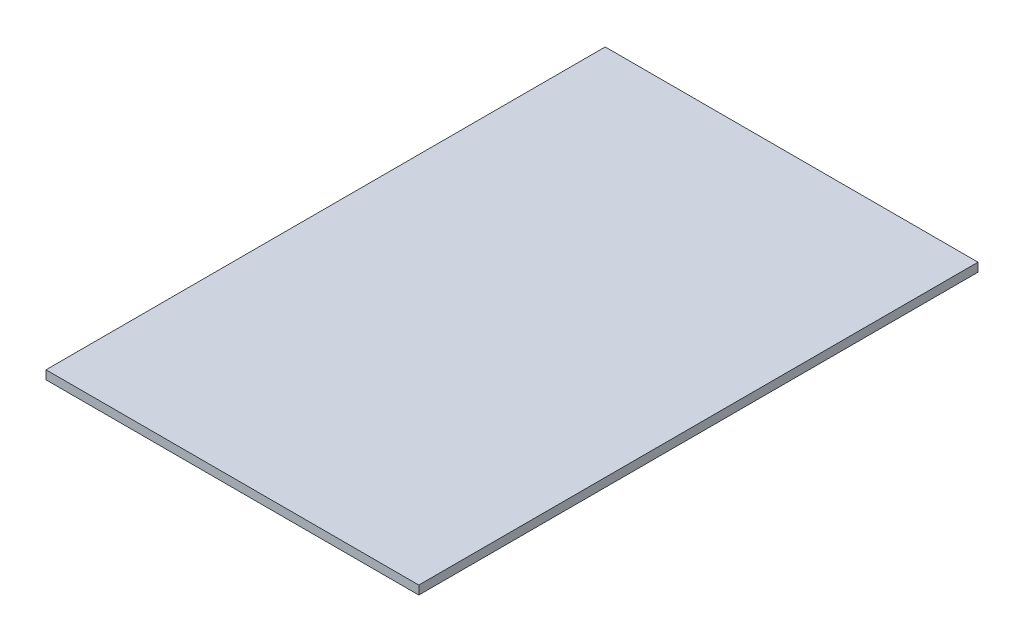
ISO-10303-21;
HEADER;
FILE_DESCRIPTION(('STEP AP214'),'2;1');
FILE_NAME('part.step','',(''),(''),'','','');
FILE_SCHEMA(('AUTOMOTIVE_DESIGN { 1 0 10303 214 1 1 1 1 }'));
ENDSEC;
DATA;
#1=APPLICATION_CONTEXT('core data for automotive mechanical design processes');
#2=APPLICATION_PROTOCOL_DEFINITION('international standard','automotive_design',2000,#1);
#3=PRODUCT_CONTEXT('',#1,'mechanical');
#4=PRODUCT('Part','Part','',(#3));
#5=PRODUCT_RELATED_PRODUCT_CATEGORY('part','',(#4));
#6=PRODUCT_DEFINITION_FORMATION('','',#4);
#7=PRODUCT_DEFINITION_CONTEXT('part definition',#1,'design');
#8=PRODUCT_DEFINITION('design','',#6,#7);
#9=PRODUCT_DEFINITION_SHAPE('','',#8);
#10=(LENGTH_UNIT() NAMED_UNIT(*) SI_UNIT(.MILLI.,.METRE.));
#11=(NAMED_UNIT(*) PLANE_ANGLE_UNIT() SI_UNIT($,.RADIAN.));
#12=(NAMED_UNIT(*) SI_UNIT($,.STERADIAN.) SOLID_ANGLE_UNIT());
#13=UNCERTAINTY_MEASURE_WITH_UNIT(LENGTH_MEASURE(1.E-05),#10,'distance_accuracy_value','');
#14=(GEOMETRIC_REPRESENTATION_CONTEXT(3) GLOBAL_UNCERTAINTY_ASSIGNED_CONTEXT((#13)) GLOBAL_UNIT_ASSIGNED_CONTEXT((#10,
#11,#12)) REPRESENTATION_CONTEXT('',''));
#15=CARTESIAN_POINT('',(0.,0.,0.));
#16=DIRECTION('',(0.,0.,1.));
#17=DIRECTION('',(1.,0.,0.));
#18=AXIS2_PLACEMENT_3D('',#15,#16,#17);
#19=CARTESIAN_POINT('',(0.,14.,0.));
#20=DIRECTION('',(1.,0.,0.));
#21=DIRECTION('',(0.,0.,-1.));
#22=AXIS2_PLACEMENT_3D('',#19,#20,#21);
#23=PLANE('',#22);
#24=DIRECTION('',(0.,0.,1.));
#25=VECTOR('',#24,1.);
#26=CARTESIAN_POINT('',(0.,0.,0.));
#27=LINE('',#26,#25);
#28=CARTESIAN_POINT('',(-1.2490009027033E-13,0.,-900.));
#29=VERTEX_POINT('',#28);
#30=CARTESIAN_POINT('',(0.,0.,0.));
#31=VERTEX_POINT('',#30);
#32=EDGE_CURVE('E107',#29,#31,#27,.T.);
#33=ORIENTED_EDGE('',*,*,#32,.T.);
#34=DIRECTION('',(0.,-1.,0.));
#35=VECTOR('',#34,1.);
#36=CARTESIAN_POINT('',(0.,14.,0.));
#37=LINE('',#36,#35);
#38=CARTESIAN_POINT('',(0.,14.,0.));
#39=VERTEX_POINT('',#38);
#40=EDGE_CURVE('E11',#39,#31,#37,.T.);
#41=ORIENTED_EDGE('',*,*,#40,.F.);
#42=DIRECTION('',(0.,0.,1.));
#43=VECTOR('',#42,1.);
#44=CARTESIAN_POINT('',(0.,14.,0.));
#45=LINE('',#44,#43);
#46=CARTESIAN_POINT('',(-1.2490009027033E-13,14.,-900.));
#47=VERTEX_POINT('',#46);
#48=EDGE_CURVE('E91',#47,#39,#45,.T.);
#49=ORIENTED_EDGE('',*,*,#48,.F.);
#50=DIRECTION('',(0.,-1.,0.));
#51=VECTOR('',#50,1.);
#52=CARTESIAN_POINT('',(-1.2490009027033E-13,14.,-900.));
#53=LINE('',#52,#51);
#54=EDGE_CURVE('E103',#47,#29,#53,.T.);
#55=ORIENTED_EDGE('',*,*,#54,.T.);
#56=EDGE_LOOP('',(#33,#41,#49,#55));
#57=FACE_BOUND('',#56,.T.);
#58=ADVANCED_FACE('F39',(#57),#23,.F.);
#59=CARTESIAN_POINT('',(0.,14.,0.));
#60=DIRECTION('',(0.,0.,-1.));
#61=DIRECTION('',(-1.,0.,0.));
#62=AXIS2_PLACEMENT_3D('',#59,#60,#61);
#63=PLANE('',#62);
#64=DIRECTION('',(1.,0.,0.));
#65=VECTOR('',#64,1.);
#66=CARTESIAN_POINT('',(0.,0.,0.));
#67=LINE('',#66,#65);
#68=CARTESIAN_POINT('',(600.,0.,0.));
#69=VERTEX_POINT('',#68);
#70=EDGE_CURVE('E96',#31,#69,#67,.T.);
#71=ORIENTED_EDGE('',*,*,#70,.T.);
#72=DIRECTION('',(0.,-1.,0.));
#73=VECTOR('',#72,1.);
#74=CARTESIAN_POINT('',(600.,14.,0.));
#75=LINE('',#74,#73);
#76=CARTESIAN_POINT('',(600.,14.,0.));
#77=VERTEX_POINT('',#76);
#78=EDGE_CURVE('E48',#77,#69,#75,.T.);
#79=ORIENTED_EDGE('',*,*,#78,.F.);
#80=DIRECTION('',(1.,0.,0.));
#81=VECTOR('',#80,1.);
#82=CARTESIAN_POINT('',(0.,14.,0.));
#83=LINE('',#82,#81);
#84=EDGE_CURVE('E86',#39,#77,#83,.T.);
#85=ORIENTED_EDGE('',*,*,#84,.F.);
#86=ORIENTED_EDGE('',*,*,#40,.T.);
#87=EDGE_LOOP('',(#71,#79,#85,#86));
#88=FACE_BOUND('',#87,.T.);
#89=ADVANCED_FACE('F95',(#88),#63,.F.);
#90=CARTESIAN_POINT('',(600.,14.,0.));
#91=DIRECTION('',(-1.,0.,0.));
#92=DIRECTION('',(0.,0.,1.));
#93=AXIS2_PLACEMENT_3D('',#90,#91,#92);
#94=PLANE('',#93);
#95=DIRECTION('',(0.,0.,-1.));
#96=VECTOR('',#95,1.);
#97=CARTESIAN_POINT('',(600.,0.,0.));
#98=LINE('',#97,#96);
#99=CARTESIAN_POINT('',(600.,0.,-900.));
#100=VERTEX_POINT('',#99);
#101=EDGE_CURVE('E73',#69,#100,#98,.T.);
#102=ORIENTED_EDGE('',*,*,#101,.T.);
#103=DIRECTION('',(0.,-1.,0.));
#104=VECTOR('',#103,1.);
#105=CARTESIAN_POINT('',(600.,14.,-900.));
#106=LINE('',#105,#104);
#107=CARTESIAN_POINT('',(600.,14.,-900.));
#108=VERTEX_POINT('',#107);
#109=EDGE_CURVE('E98',#108,#100,#106,.T.);
#110=ORIENTED_EDGE('',*,*,#109,.F.);
#111=DIRECTION('',(0.,0.,-1.));
#112=VECTOR('',#111,1.);
#113=CARTESIAN_POINT('',(600.,14.,0.));
#114=LINE('',#113,#112);
#115=EDGE_CURVE('E89',#77,#108,#114,.T.);
#116=ORIENTED_EDGE('',*,*,#115,.F.);
#117=ORIENTED_EDGE('',*,*,#78,.T.);
#118=EDGE_LOOP('',(#102,#110,#116,#117));
#119=FACE_BOUND('',#118,.T.);
#120=ADVANCED_FACE('F99',(#119),#94,.F.);
#121=CARTESIAN_POINT('',(-1.2490009027033E-13,14.,-900.));
#122=DIRECTION('',(0.,0.,1.));
#123=DIRECTION('',(1.,0.,0.));
#124=AXIS2_PLACEMENT_3D('',#121,#122,#123);
#125=PLANE('',#124);
#126=DIRECTION('',(-1.,0.,0.));
#127=VECTOR('',#126,1.);
#128=CARTESIAN_POINT('',(-1.2490009027033E-13,0.,-900.));
#129=LINE('',#128,#127);
#130=EDGE_CURVE('E79',#100,#29,#129,.T.);
#131=ORIENTED_EDGE('',*,*,#130,.T.);
#132=ORIENTED_EDGE('',*,*,#54,.F.);
#133=DIRECTION('',(-1.,0.,0.));
#134=VECTOR('',#133,1.);
#135=CARTESIAN_POINT('',(-1.2490009027033E-13,14.,-900.));
#136=LINE('',#135,#134);
#137=EDGE_CURVE('E56',#108,#47,#136,.T.);
#138=ORIENTED_EDGE('',*,*,#137,.F.);
#139=ORIENTED_EDGE('',*,*,#109,.T.);
#140=EDGE_LOOP('',(#131,#132,#138,#139));
#141=FACE_BOUND('',#140,.T.);
#142=ADVANCED_FACE('F120',(#141),#125,.F.);
#143=CARTESIAN_POINT('',(0.,14.,0.));
#144=DIRECTION('',(0.,-1.,0.));
#145=DIRECTION('',(0.,0.,-1.));
#146=AXIS2_PLACEMENT_3D('',#143,#144,#145);
#147=PLANE('',#146);
#148=ORIENTED_EDGE('',*,*,#48,.T.);
#149=ORIENTED_EDGE('',*,*,#84,.T.);
#150=ORIENTED_EDGE('',*,*,#115,.T.);
#151=ORIENTED_EDGE('',*,*,#137,.T.);
#152=EDGE_LOOP('',(#148,#149,#150,#151));
#153=FACE_BOUND('',#152,.T.);
#154=ADVANCED_FACE('F87',(#153),#147,.F.);
#155=CARTESIAN_POINT('',(0.,0.,0.));
#156=DIRECTION('',(0.,-1.,0.));
#157=DIRECTION('',(0.,0.,-1.));
#158=AXIS2_PLACEMENT_3D('',#155,#156,#157);
#159=PLANE('',#158);
#160=ORIENTED_EDGE('',*,*,#32,.F.);
#161=ORIENTED_EDGE('',*,*,#130,.F.);
#162=ORIENTED_EDGE('',*,*,#101,.F.);
#163=ORIENTED_EDGE('',*,*,#70,.F.);
#164=EDGE_LOOP('',(#160,#161,#162,#163));
#165=FACE_BOUND('',#164,.T.);
#166=ADVANCED_FACE('F123',(#165),#159,.T.);
#167=CLOSED_SHELL('',(#58,#89,#120,#142,#154,#166));
#168=MANIFOLD_SOLID_BREP('B2',#167);
#169=ADVANCED_BREP_SHAPE_REPRESENTATION('',(#18,#168),#14);
#170=SHAPE_DEFINITION_REPRESENTATION(#9,#169);
ENDSEC;
END-ISO-10303-21;
